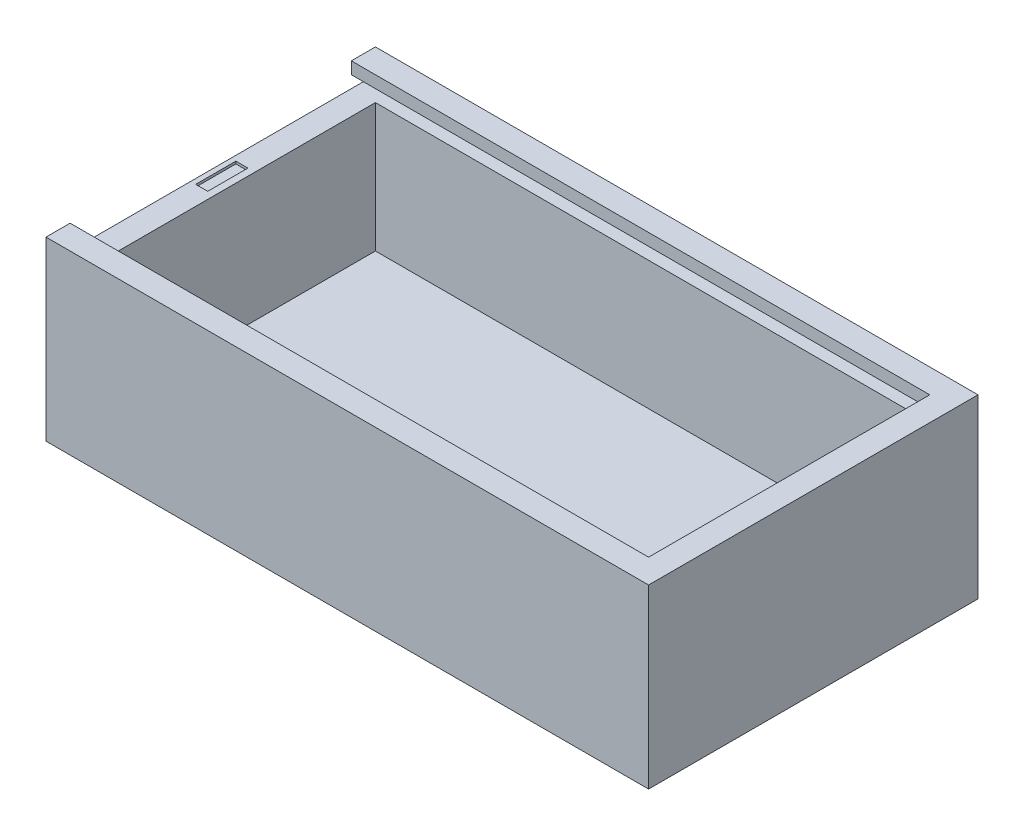
ISO-10303-21;
HEADER;
FILE_DESCRIPTION(('STEP AP214'),'2;1');
FILE_NAME('part.step','',(''),(''),'','','');
FILE_SCHEMA(('AUTOMOTIVE_DESIGN { 1 0 10303 214 1 1 1 1 }'));
ENDSEC;
DATA;
#1=APPLICATION_CONTEXT('core data for automotive mechanical design processes');
#2=APPLICATION_PROTOCOL_DEFINITION('international standard','automotive_design',2000,#1);
#3=PRODUCT_CONTEXT('',#1,'mechanical');
#4=PRODUCT('Part','Part','',(#3));
#5=PRODUCT_RELATED_PRODUCT_CATEGORY('part','',(#4));
#6=PRODUCT_DEFINITION_FORMATION('','',#4);
#7=PRODUCT_DEFINITION_CONTEXT('part definition',#1,'design');
#8=PRODUCT_DEFINITION('design','',#6,#7);
#9=PRODUCT_DEFINITION_SHAPE('','',#8);
#10=(LENGTH_UNIT() NAMED_UNIT(*) SI_UNIT(.MILLI.,.METRE.));
#11=(NAMED_UNIT(*) PLANE_ANGLE_UNIT() SI_UNIT($,.RADIAN.));
#12=(NAMED_UNIT(*) SI_UNIT($,.STERADIAN.) SOLID_ANGLE_UNIT());
#13=UNCERTAINTY_MEASURE_WITH_UNIT(LENGTH_MEASURE(1.E-05),#10,'distance_accuracy_value','');
#14=(GEOMETRIC_REPRESENTATION_CONTEXT(3) GLOBAL_UNCERTAINTY_ASSIGNED_CONTEXT((#13)) GLOBAL_UNIT_ASSIGNED_CONTEXT((#10,
#11,#12)) REPRESENTATION_CONTEXT('',''));
#15=CARTESIAN_POINT('',(0.,0.,0.));
#16=DIRECTION('',(0.,0.,1.));
#17=DIRECTION('',(1.,0.,0.));
#18=AXIS2_PLACEMENT_3D('',#15,#16,#17);
#19=CARTESIAN_POINT('',(34.5,22.,17.5));
#20=DIRECTION('',(-1.,0.,0.));
#21=DIRECTION('',(0.,0.,1.));
#22=AXIS2_PLACEMENT_3D('',#19,#20,#21);
#23=PLANE('',#22);
#24=DIRECTION('',(0.,0.,1.));
#25=VECTOR('',#24,1.);
#26=CARTESIAN_POINT('',(34.5,19.,19.));
#27=LINE('',#26,#25);
#28=CARTESIAN_POINT('',(34.5,19.,-17.5));
#29=VERTEX_POINT('',#28);
#30=CARTESIAN_POINT('',(34.5,19.,17.5));
#31=VERTEX_POINT('',#30);
#32=EDGE_CURVE('E208',#29,#31,#27,.T.);
#33=ORIENTED_EDGE('',*,*,#32,.F.);
#34=DIRECTION('',(0.,-1.,0.));
#35=VECTOR('',#34,1.);
#36=CARTESIAN_POINT('',(34.5,22.,-17.5));
#37=LINE('',#36,#35);
#38=CARTESIAN_POINT('',(34.5,3.,-17.5));
#39=VERTEX_POINT('',#38);
#40=EDGE_CURVE('E286',#29,#39,#37,.T.);
#41=ORIENTED_EDGE('',*,*,#40,.T.);
#42=DIRECTION('',(0.,0.,-1.));
#43=VECTOR('',#42,1.);
#44=CARTESIAN_POINT('',(34.5,3.,0.));
#45=LINE('',#44,#43);
#46=CARTESIAN_POINT('',(34.5,3.,17.5));
#47=VERTEX_POINT('',#46);
#48=EDGE_CURVE('E270',#47,#39,#45,.T.);
#49=ORIENTED_EDGE('',*,*,#48,.F.);
#50=DIRECTION('',(0.,-1.,0.));
#51=VECTOR('',#50,1.);
#52=CARTESIAN_POINT('',(34.5,22.,17.5));
#53=LINE('',#52,#51);
#54=EDGE_CURVE('E58',#31,#47,#53,.T.);
#55=ORIENTED_EDGE('',*,*,#54,.F.);
#56=EDGE_LOOP('',(#33,#41,#49,#55));
#57=FACE_BOUND('',#56,.T.);
#58=ADVANCED_FACE('F35',(#57),#23,.T.);
#59=CARTESIAN_POINT('',(34.5,22.,17.5));
#60=DIRECTION('',(0.,0.,-1.));
#61=DIRECTION('',(-1.,0.,0.));
#62=AXIS2_PLACEMENT_3D('',#59,#60,#61);
#63=PLANE('',#62);
#64=CARTESIAN_POINT('',(34.5,22.,17.5));
#65=VERTEX_POINT('',#64);
#66=CARTESIAN_POINT('',(34.5,20.5,17.5));
#67=VERTEX_POINT('',#66);
#68=EDGE_CURVE('E290',#65,#67,#53,.T.);
#69=ORIENTED_EDGE('',*,*,#68,.T.);
#70=DIRECTION('',(-1.,0.,0.));
#71=VECTOR('',#70,1.);
#72=CARTESIAN_POINT('',(34.5,20.5,17.5));
#73=LINE('',#72,#71);
#74=CARTESIAN_POINT('',(-37.5,20.5,17.5));
#75=VERTEX_POINT('',#74);
#76=EDGE_CURVE('E256',#67,#75,#73,.T.);
#77=ORIENTED_EDGE('',*,*,#76,.T.);
#78=DIRECTION('',(0.,1.,0.));
#79=VECTOR('',#78,1.);
#80=CARTESIAN_POINT('',(-37.5,0.,17.5));
#81=LINE('',#80,#79);
#82=CARTESIAN_POINT('',(-37.5,22.,17.5));
#83=VERTEX_POINT('',#82);
#84=EDGE_CURVE('E236',#75,#83,#81,.T.);
#85=ORIENTED_EDGE('',*,*,#84,.T.);
#86=DIRECTION('',(1.,0.,0.));
#87=VECTOR('',#86,1.);
#88=CARTESIAN_POINT('',(34.5,22.,17.5));
#89=LINE('',#88,#87);
#90=EDGE_CURVE('E276',#83,#65,#89,.T.);
#91=ORIENTED_EDGE('',*,*,#90,.T.);
#92=EDGE_LOOP('',(#69,#77,#85,#91));
#93=FACE_BOUND('',#92,.T.);
#94=ADVANCED_FACE('F350',(#93),#63,.T.);
#95=CARTESIAN_POINT('',(34.5,22.,-17.5));
#96=DIRECTION('',(0.,0.,1.));
#97=DIRECTION('',(1.,0.,0.));
#98=AXIS2_PLACEMENT_3D('',#95,#96,#97);
#99=PLANE('',#98);
#100=DIRECTION('',(1.,0.,0.));
#101=VECTOR('',#100,1.);
#102=CARTESIAN_POINT('',(34.5,19.,-17.5));
#103=LINE('',#102,#101);
#104=CARTESIAN_POINT('',(-34.5,19.,-17.5));
#105=VERTEX_POINT('',#104);
#106=EDGE_CURVE('E251',#105,#29,#103,.T.);
#107=ORIENTED_EDGE('',*,*,#106,.F.);
#108=DIRECTION('',(0.,-1.,0.));
#109=VECTOR('',#108,1.);
#110=CARTESIAN_POINT('',(-34.5,22.,-17.5));
#111=LINE('',#110,#109);
#112=CARTESIAN_POINT('',(-34.5,3.,-17.5));
#113=VERTEX_POINT('',#112);
#114=EDGE_CURVE('E284',#105,#113,#111,.T.);
#115=ORIENTED_EDGE('',*,*,#114,.T.);
#116=DIRECTION('',(-1.,0.,0.));
#117=VECTOR('',#116,1.);
#118=CARTESIAN_POINT('',(0.,3.,-17.5));
#119=LINE('',#118,#117);
#120=EDGE_CURVE('E273',#39,#113,#119,.T.);
#121=ORIENTED_EDGE('',*,*,#120,.F.);
#122=ORIENTED_EDGE('',*,*,#40,.F.);
#123=EDGE_LOOP('',(#107,#115,#121,#122));
#124=FACE_BOUND('',#123,.T.);
#125=ADVANCED_FACE('F384',(#124),#99,.T.);
#126=CARTESIAN_POINT('',(0.,22.,0.));
#127=DIRECTION('',(0.,1.,0.));
#128=DIRECTION('',(0.,0.,1.));
#129=AXIS2_PLACEMENT_3D('',#126,#127,#128);
#130=PLANE('',#129);
#131=DIRECTION('',(0.,0.,1.));
#132=VECTOR('',#131,1.);
#133=CARTESIAN_POINT('',(-37.5,22.,-20.5));
#134=LINE('',#133,#132);
#135=CARTESIAN_POINT('',(-37.5,22.,-20.5));
#136=VERTEX_POINT('',#135);
#137=CARTESIAN_POINT('',(-37.5,22.,-17.5));
#138=VERTEX_POINT('',#137);
#139=EDGE_CURVE('E294',#136,#138,#134,.T.);
#140=ORIENTED_EDGE('',*,*,#139,.T.);
#141=DIRECTION('',(-1.,0.,0.));
#142=VECTOR('',#141,1.);
#143=CARTESIAN_POINT('',(34.5,22.,-17.5));
#144=LINE('',#143,#142);
#145=CARTESIAN_POINT('',(34.5,22.,-17.5));
#146=VERTEX_POINT('',#145);
#147=EDGE_CURVE('E280',#146,#138,#144,.T.);
#148=ORIENTED_EDGE('',*,*,#147,.F.);
#149=DIRECTION('',(0.,0.,-1.));
#150=VECTOR('',#149,1.);
#151=CARTESIAN_POINT('',(34.5,22.,17.5));
#152=LINE('',#151,#150);
#153=EDGE_CURVE('E278',#65,#146,#152,.T.);
#154=ORIENTED_EDGE('',*,*,#153,.F.);
#155=ORIENTED_EDGE('',*,*,#90,.F.);
#156=CARTESIAN_POINT('',(-37.5,22.,20.5));
#157=VERTEX_POINT('',#156);
#158=EDGE_CURVE('E298',#83,#157,#134,.T.);
#159=ORIENTED_EDGE('',*,*,#158,.T.);
#160=DIRECTION('',(1.,0.,0.));
#161=VECTOR('',#160,1.);
#162=CARTESIAN_POINT('',(-37.5,22.,20.5));
#163=LINE('',#162,#161);
#164=CARTESIAN_POINT('',(37.5,22.,20.5));
#165=VERTEX_POINT('',#164);
#166=EDGE_CURVE('E297',#157,#165,#163,.T.);
#167=ORIENTED_EDGE('',*,*,#166,.T.);
#168=DIRECTION('',(0.,0.,-1.));
#169=VECTOR('',#168,1.);
#170=CARTESIAN_POINT('',(37.5,22.,-20.5));
#171=LINE('',#170,#169);
#172=CARTESIAN_POINT('',(37.5,22.,-20.5));
#173=VERTEX_POINT('',#172);
#174=EDGE_CURVE('E300',#165,#173,#171,.T.);
#175=ORIENTED_EDGE('',*,*,#174,.T.);
#176=DIRECTION('',(-1.,0.,0.));
#177=VECTOR('',#176,1.);
#178=CARTESIAN_POINT('',(-37.5,22.,-20.5));
#179=LINE('',#178,#177);
#180=EDGE_CURVE('E302',#173,#136,#179,.T.);
#181=ORIENTED_EDGE('',*,*,#180,.T.);
#182=EDGE_LOOP('',(#140,#148,#154,#155,#159,#167,#175,#181));
#183=FACE_BOUND('',#182,.T.);
#184=ADVANCED_FACE('F344',(#183),#130,.T.);
#185=CARTESIAN_POINT('',(0.,0.,0.));
#186=DIRECTION('',(0.,1.,0.));
#187=DIRECTION('',(0.,0.,1.));
#188=AXIS2_PLACEMENT_3D('',#185,#186,#187);
#189=PLANE('',#188);
#190=DIRECTION('',(0.,0.,1.));
#191=VECTOR('',#190,1.);
#192=CARTESIAN_POINT('',(-37.5,0.,-20.5));
#193=LINE('',#192,#191);
#194=CARTESIAN_POINT('',(-37.5,0.,-20.5));
#195=VERTEX_POINT('',#194);
#196=CARTESIAN_POINT('',(-37.5,0.,20.5));
#197=VERTEX_POINT('',#196);
#198=EDGE_CURVE('E293',#195,#197,#193,.T.);
#199=ORIENTED_EDGE('',*,*,#198,.F.);
#200=DIRECTION('',(-1.,0.,0.));
#201=VECTOR('',#200,1.);
#202=CARTESIAN_POINT('',(-37.5,0.,-20.5));
#203=LINE('',#202,#201);
#204=CARTESIAN_POINT('',(37.5,0.,-20.5));
#205=VERTEX_POINT('',#204);
#206=EDGE_CURVE('E311',#205,#195,#203,.T.);
#207=ORIENTED_EDGE('',*,*,#206,.F.);
#208=DIRECTION('',(0.,0.,-1.));
#209=VECTOR('',#208,1.);
#210=CARTESIAN_POINT('',(37.5,0.,-20.5));
#211=LINE('',#210,#209);
#212=CARTESIAN_POINT('',(37.5,0.,20.5));
#213=VERTEX_POINT('',#212);
#214=EDGE_CURVE('E309',#213,#205,#211,.T.);
#215=ORIENTED_EDGE('',*,*,#214,.F.);
#216=DIRECTION('',(1.,0.,0.));
#217=VECTOR('',#216,1.);
#218=CARTESIAN_POINT('',(-37.5,0.,20.5));
#219=LINE('',#218,#217);
#220=EDGE_CURVE('E307',#197,#213,#219,.T.);
#221=ORIENTED_EDGE('',*,*,#220,.F.);
#222=EDGE_LOOP('',(#199,#207,#215,#221));
#223=FACE_BOUND('',#222,.T.);
#224=ADVANCED_FACE('F334',(#223),#189,.F.);
#225=CARTESIAN_POINT('',(-37.5,22.,-20.5));
#226=DIRECTION('',(1.,0.,0.));
#227=DIRECTION('',(0.,0.,-1.));
#228=AXIS2_PLACEMENT_3D('',#225,#226,#227);
#229=PLANE('',#228);
#230=DIRECTION('',(0.,0.,-1.));
#231=VECTOR('',#230,1.);
#232=CARTESIAN_POINT('',(-37.5,20.5,0.));
#233=LINE('',#232,#231);
#234=CARTESIAN_POINT('',(-37.5,20.5,-17.5));
#235=VERTEX_POINT('',#234);
#236=CARTESIAN_POINT('',(-37.5,20.5,-19.));
#237=VERTEX_POINT('',#236);
#238=EDGE_CURVE('E242',#235,#237,#233,.T.);
#239=ORIENTED_EDGE('',*,*,#238,.F.);
#240=DIRECTION('',(0.,-1.,0.));
#241=VECTOR('',#240,1.);
#242=CARTESIAN_POINT('',(-37.5,0.,-17.5));
#243=LINE('',#242,#241);
#244=EDGE_CURVE('E239',#138,#235,#243,.T.);
#245=ORIENTED_EDGE('',*,*,#244,.F.);
#246=ORIENTED_EDGE('',*,*,#139,.F.);
#247=DIRECTION('',(0.,-1.,0.));
#248=VECTOR('',#247,1.);
#249=CARTESIAN_POINT('',(-37.5,22.,-20.5));
#250=LINE('',#249,#248);
#251=EDGE_CURVE('E304',#136,#195,#250,.T.);
#252=ORIENTED_EDGE('',*,*,#251,.T.);
#253=ORIENTED_EDGE('',*,*,#198,.T.);
#254=DIRECTION('',(0.,-1.,0.));
#255=VECTOR('',#254,1.);
#256=CARTESIAN_POINT('',(-37.5,22.,20.5));
#257=LINE('',#256,#255);
#258=EDGE_CURVE('E43',#157,#197,#257,.T.);
#259=ORIENTED_EDGE('',*,*,#258,.F.);
#260=ORIENTED_EDGE('',*,*,#158,.F.);
#261=ORIENTED_EDGE('',*,*,#84,.F.);
#262=DIRECTION('',(0.,0.,1.));
#263=VECTOR('',#262,1.);
#264=CARTESIAN_POINT('',(-37.5,20.5,0.));
#265=LINE('',#264,#263);
#266=CARTESIAN_POINT('',(-37.5,20.5,19.));
#267=VERTEX_POINT('',#266);
#268=EDGE_CURVE('E233',#75,#267,#265,.T.);
#269=ORIENTED_EDGE('',*,*,#268,.T.);
#270=DIRECTION('',(0.,-1.,0.));
#271=VECTOR('',#270,1.);
#272=CARTESIAN_POINT('',(-37.5,0.,19.));
#273=LINE('',#272,#271);
#274=CARTESIAN_POINT('',(-37.5,19.,19.));
#275=VERTEX_POINT('',#274);
#276=EDGE_CURVE('E230',#267,#275,#273,.T.);
#277=ORIENTED_EDGE('',*,*,#276,.T.);
#278=DIRECTION('',(0.,0.,1.));
#279=VECTOR('',#278,1.);
#280=CARTESIAN_POINT('',(-37.5,19.,0.));
#281=LINE('',#280,#279);
#282=CARTESIAN_POINT('',(-37.5,19.,-19.));
#283=VERTEX_POINT('',#282);
#284=EDGE_CURVE('E225',#283,#275,#281,.T.);
#285=ORIENTED_EDGE('',*,*,#284,.F.);
#286=DIRECTION('',(0.,-1.,0.));
#287=VECTOR('',#286,1.);
#288=CARTESIAN_POINT('',(-37.5,0.,-19.));
#289=LINE('',#288,#287);
#290=EDGE_CURVE('E245',#237,#283,#289,.T.);
#291=ORIENTED_EDGE('',*,*,#290,.F.);
#292=EDGE_LOOP('',(#239,#245,#246,#252,#253,#259,#260,#261,#269,#277,#285,#291));
#293=FACE_BOUND('',#292,.T.);
#294=ADVANCED_FACE('F37',(#293),#229,.F.);
#295=CARTESIAN_POINT('',(-37.5,22.,20.5));
#296=DIRECTION('',(0.,0.,-1.));
#297=DIRECTION('',(-1.,0.,0.));
#298=AXIS2_PLACEMENT_3D('',#295,#296,#297);
#299=PLANE('',#298);
#300=ORIENTED_EDGE('',*,*,#220,.T.);
#301=DIRECTION('',(0.,-1.,0.));
#302=VECTOR('',#301,1.);
#303=CARTESIAN_POINT('',(37.5,22.,20.5));
#304=LINE('',#303,#302);
#305=EDGE_CURVE('E318',#165,#213,#304,.T.);
#306=ORIENTED_EDGE('',*,*,#305,.F.);
#307=ORIENTED_EDGE('',*,*,#166,.F.);
#308=ORIENTED_EDGE('',*,*,#258,.T.);
#309=EDGE_LOOP('',(#300,#306,#307,#308));
#310=FACE_BOUND('',#309,.T.);
#311=ADVANCED_FACE('F324',(#310),#299,.F.);
#312=CARTESIAN_POINT('',(37.5,22.,-20.5));
#313=DIRECTION('',(-1.,0.,0.));
#314=DIRECTION('',(0.,0.,1.));
#315=AXIS2_PLACEMENT_3D('',#312,#313,#314);
#316=PLANE('',#315);
#317=ORIENTED_EDGE('',*,*,#214,.T.);
#318=DIRECTION('',(0.,-1.,0.));
#319=VECTOR('',#318,1.);
#320=CARTESIAN_POINT('',(37.5,22.,-20.5));
#321=LINE('',#320,#319);
#322=EDGE_CURVE('E315',#173,#205,#321,.T.);
#323=ORIENTED_EDGE('',*,*,#322,.F.);
#324=ORIENTED_EDGE('',*,*,#174,.F.);
#325=ORIENTED_EDGE('',*,*,#305,.T.);
#326=EDGE_LOOP('',(#317,#323,#324,#325));
#327=FACE_BOUND('',#326,.T.);
#328=ADVANCED_FACE('F338',(#327),#316,.F.);
#329=CARTESIAN_POINT('',(-37.5,22.,-20.5));
#330=DIRECTION('',(0.,0.,1.));
#331=DIRECTION('',(1.,0.,0.));
#332=AXIS2_PLACEMENT_3D('',#329,#330,#331);
#333=PLANE('',#332);
#334=ORIENTED_EDGE('',*,*,#206,.T.);
#335=ORIENTED_EDGE('',*,*,#251,.F.);
#336=ORIENTED_EDGE('',*,*,#180,.F.);
#337=ORIENTED_EDGE('',*,*,#322,.T.);
#338=EDGE_LOOP('',(#334,#335,#336,#337));
#339=FACE_BOUND('',#338,.T.);
#340=ADVANCED_FACE('F342',(#339),#333,.F.);
#341=DIRECTION('',(-1.,0.,0.));
#342=VECTOR('',#341,1.);
#343=CARTESIAN_POINT('',(34.5,19.,17.5));
#344=LINE('',#343,#342);
#345=CARTESIAN_POINT('',(-34.5,19.,17.5));
#346=VERTEX_POINT('',#345);
#347=EDGE_CURVE('E263',#31,#346,#344,.T.);
#348=ORIENTED_EDGE('',*,*,#347,.F.);
#349=ORIENTED_EDGE('',*,*,#54,.T.);
#350=DIRECTION('',(-1.,0.,0.));
#351=VECTOR('',#350,1.);
#352=CARTESIAN_POINT('',(0.,3.,17.5));
#353=LINE('',#352,#351);
#354=CARTESIAN_POINT('',(-34.5,3.,17.5));
#355=VERTEX_POINT('',#354);
#356=EDGE_CURVE('E268',#47,#355,#353,.T.);
#357=ORIENTED_EDGE('',*,*,#356,.T.);
#358=DIRECTION('',(0.,-1.,0.));
#359=VECTOR('',#358,1.);
#360=CARTESIAN_POINT('',(-34.5,22.,17.5));
#361=LINE('',#360,#359);
#362=EDGE_CURVE('E282',#346,#355,#361,.T.);
#363=ORIENTED_EDGE('',*,*,#362,.F.);
#364=EDGE_LOOP('',(#348,#349,#357,#363));
#365=FACE_BOUND('',#364,.T.);
#366=ADVANCED_FACE('F376',(#365),#63,.T.);
#367=DIRECTION('',(0.,0.,-1.));
#368=VECTOR('',#367,1.);
#369=CARTESIAN_POINT('',(34.5,20.5,-19.));
#370=LINE('',#369,#368);
#371=CARTESIAN_POINT('',(34.5,20.5,-17.5));
#372=VERTEX_POINT('',#371);
#373=EDGE_CURVE('E216',#67,#372,#370,.T.);
#374=ORIENTED_EDGE('',*,*,#373,.F.);
#375=ORIENTED_EDGE('',*,*,#68,.F.);
#376=ORIENTED_EDGE('',*,*,#153,.T.);
#377=EDGE_CURVE('E287',#146,#372,#37,.T.);
#378=ORIENTED_EDGE('',*,*,#377,.T.);
#379=EDGE_LOOP('',(#374,#375,#376,#378));
#380=FACE_BOUND('',#379,.T.);
#381=ADVANCED_FACE('F374',(#380),#23,.T.);
#382=DIRECTION('',(-1.,0.,0.));
#383=VECTOR('',#382,1.);
#384=CARTESIAN_POINT('',(34.5,20.5,-17.5));
#385=LINE('',#384,#383);
#386=EDGE_CURVE('E254',#372,#235,#385,.T.);
#387=ORIENTED_EDGE('',*,*,#386,.F.);
#388=ORIENTED_EDGE('',*,*,#377,.F.);
#389=ORIENTED_EDGE('',*,*,#147,.T.);
#390=ORIENTED_EDGE('',*,*,#244,.T.);
#391=EDGE_LOOP('',(#387,#388,#389,#390));
#392=FACE_BOUND('',#391,.T.);
#393=ADVANCED_FACE('F371',(#392),#99,.T.);
#394=CARTESIAN_POINT('',(-34.5,22.,17.5));
#395=DIRECTION('',(1.,0.,0.));
#396=DIRECTION('',(0.,0.,-1.));
#397=AXIS2_PLACEMENT_3D('',#394,#395,#396);
#398=PLANE('',#397);
#399=DIRECTION('',(0.,0.,-1.));
#400=VECTOR('',#399,1.);
#401=CARTESIAN_POINT('',(-34.5,19.,17.5));
#402=LINE('',#401,#400);
#403=EDGE_CURVE('E11',#346,#105,#402,.T.);
#404=ORIENTED_EDGE('',*,*,#403,.F.);
#405=ORIENTED_EDGE('',*,*,#362,.T.);
#406=DIRECTION('',(0.,0.,-1.));
#407=VECTOR('',#406,1.);
#408=CARTESIAN_POINT('',(-34.5,3.,0.));
#409=LINE('',#408,#407);
#410=EDGE_CURVE('E265',#355,#113,#409,.T.);
#411=ORIENTED_EDGE('',*,*,#410,.T.);
#412=ORIENTED_EDGE('',*,*,#114,.F.);
#413=EDGE_LOOP('',(#404,#405,#411,#412));
#414=FACE_BOUND('',#413,.T.);
#415=ADVANCED_FACE('F382',(#414),#398,.T.);
#416=CARTESIAN_POINT('',(0.,3.,0.));
#417=DIRECTION('',(0.,1.,0.));
#418=DIRECTION('',(0.,0.,1.));
#419=AXIS2_PLACEMENT_3D('',#416,#417,#418);
#420=PLANE('',#419);
#421=ORIENTED_EDGE('',*,*,#410,.F.);
#422=ORIENTED_EDGE('',*,*,#356,.F.);
#423=ORIENTED_EDGE('',*,*,#48,.T.);
#424=ORIENTED_EDGE('',*,*,#120,.T.);
#425=EDGE_LOOP('',(#421,#422,#423,#424));
#426=FACE_BOUND('',#425,.T.);
#427=ADVANCED_FACE('F401',(#426),#420,.T.);
#428=CARTESIAN_POINT('',(34.5,19.,0.));
#429=DIRECTION('',(0.,-1.,0.));
#430=DIRECTION('',(0.,0.,-1.));
#431=AXIS2_PLACEMENT_3D('',#428,#429,#430);
#432=PLANE('',#431);
#433=DIRECTION('',(1.,0.,0.));
#434=VECTOR('',#433,1.);
#435=CARTESIAN_POINT('',(-36.871212609298,19.,2.5));
#436=LINE('',#435,#434);
#437=CARTESIAN_POINT('',(-36.871212609298,19.,2.5));
#438=VERTEX_POINT('',#437);
#439=CARTESIAN_POINT('',(-35.371212609298,19.,2.5));
#440=VERTEX_POINT('',#439);
#441=EDGE_CURVE('E202',#438,#440,#436,.T.);
#442=ORIENTED_EDGE('',*,*,#441,.F.);
#443=DIRECTION('',(0.,0.,1.));
#444=VECTOR('',#443,1.);
#445=CARTESIAN_POINT('',(-36.871212609298,19.,2.5));
#446=LINE('',#445,#444);
#447=CARTESIAN_POINT('',(-36.871212609298,19.,-2.5));
#448=VERTEX_POINT('',#447);
#449=EDGE_CURVE('E50',#448,#438,#446,.T.);
#450=ORIENTED_EDGE('',*,*,#449,.F.);
#451=DIRECTION('',(-1.,0.,0.));
#452=VECTOR('',#451,1.);
#453=CARTESIAN_POINT('',(-36.871212609298,19.,-2.5));
#454=LINE('',#453,#452);
#455=CARTESIAN_POINT('',(-35.371212609298,19.,-2.5));
#456=VERTEX_POINT('',#455);
#457=EDGE_CURVE('E193',#456,#448,#454,.T.);
#458=ORIENTED_EDGE('',*,*,#457,.F.);
#459=DIRECTION('',(0.,0.,-1.));
#460=VECTOR('',#459,1.);
#461=CARTESIAN_POINT('',(-35.371212609298,19.,2.5));
#462=LINE('',#461,#460);
#463=EDGE_CURVE('E196',#440,#456,#462,.T.);
#464=ORIENTED_EDGE('',*,*,#463,.F.);
#465=EDGE_LOOP('',(#442,#450,#458,#464));
#466=FACE_BOUND('',#465,.T.);
#467=ORIENTED_EDGE('',*,*,#106,.T.);
#468=ORIENTED_EDGE('',*,*,#32,.T.);
#469=ORIENTED_EDGE('',*,*,#347,.T.);
#470=ORIENTED_EDGE('',*,*,#403,.T.);
#471=EDGE_LOOP('',(#467,#468,#469,#470));
#472=FACE_BOUND('',#471,.T.);
#473=DIRECTION('',(0.,0.,1.));
#474=VECTOR('',#473,1.);
#475=CARTESIAN_POINT('',(36.,19.,19.));
#476=LINE('',#475,#474);
#477=CARTESIAN_POINT('',(36.,19.,-19.));
#478=VERTEX_POINT('',#477);
#479=CARTESIAN_POINT('',(36.,19.,19.));
#480=VERTEX_POINT('',#479);
#481=EDGE_CURVE('E212',#478,#480,#476,.T.);
#482=ORIENTED_EDGE('',*,*,#481,.F.);
#483=DIRECTION('',(-1.,0.,0.));
#484=VECTOR('',#483,1.);
#485=CARTESIAN_POINT('',(34.5,19.,-19.));
#486=LINE('',#485,#484);
#487=EDGE_CURVE('E249',#478,#283,#486,.T.);
#488=ORIENTED_EDGE('',*,*,#487,.T.);
#489=ORIENTED_EDGE('',*,*,#284,.T.);
#490=DIRECTION('',(-1.,0.,0.));
#491=VECTOR('',#490,1.);
#492=CARTESIAN_POINT('',(34.5,19.,19.));
#493=LINE('',#492,#491);
#494=EDGE_CURVE('E248',#480,#275,#493,.T.);
#495=ORIENTED_EDGE('',*,*,#494,.F.);
#496=EDGE_LOOP('',(#482,#488,#489,#495));
#497=FACE_BOUND('',#496,.T.);
#498=ADVANCED_FACE('F364',(#466,#472,#497),#432,.F.);
#499=CARTESIAN_POINT('',(34.5,0.,-19.));
#500=DIRECTION('',(0.,0.,-1.));
#501=DIRECTION('',(-1.,0.,0.));
#502=AXIS2_PLACEMENT_3D('',#499,#500,#501);
#503=PLANE('',#502);
#504=ORIENTED_EDGE('',*,*,#290,.T.);
#505=ORIENTED_EDGE('',*,*,#487,.F.);
#506=DIRECTION('',(0.,-1.,0.));
#507=VECTOR('',#506,1.);
#508=CARTESIAN_POINT('',(36.,19.,-19.));
#509=LINE('',#508,#507);
#510=CARTESIAN_POINT('',(36.,20.5,-19.));
#511=VERTEX_POINT('',#510);
#512=EDGE_CURVE('E222',#511,#478,#509,.T.);
#513=ORIENTED_EDGE('',*,*,#512,.F.);
#514=DIRECTION('',(-1.,0.,0.));
#515=VECTOR('',#514,1.);
#516=CARTESIAN_POINT('',(34.5,20.5,-19.));
#517=LINE('',#516,#515);
#518=EDGE_CURVE('E252',#511,#237,#517,.T.);
#519=ORIENTED_EDGE('',*,*,#518,.T.);
#520=EDGE_LOOP('',(#504,#505,#513,#519));
#521=FACE_BOUND('',#520,.T.);
#522=ADVANCED_FACE('F367',(#521),#503,.F.);
#523=CARTESIAN_POINT('',(34.5,20.5,0.));
#524=DIRECTION('',(0.,1.,0.));
#525=DIRECTION('',(0.,0.,1.));
#526=AXIS2_PLACEMENT_3D('',#523,#524,#525);
#527=PLANE('',#526);
#528=ORIENTED_EDGE('',*,*,#238,.T.);
#529=ORIENTED_EDGE('',*,*,#518,.F.);
#530=DIRECTION('',(0.,0.,-1.));
#531=VECTOR('',#530,1.);
#532=CARTESIAN_POINT('',(36.,20.5,-19.));
#533=LINE('',#532,#531);
#534=CARTESIAN_POINT('',(36.,20.5,19.));
#535=VERTEX_POINT('',#534);
#536=EDGE_CURVE('E219',#535,#511,#533,.T.);
#537=ORIENTED_EDGE('',*,*,#536,.F.);
#538=DIRECTION('',(-1.,0.,0.));
#539=VECTOR('',#538,1.);
#540=CARTESIAN_POINT('',(34.5,20.5,19.));
#541=LINE('',#540,#539);
#542=EDGE_CURVE('E258',#535,#267,#541,.T.);
#543=ORIENTED_EDGE('',*,*,#542,.T.);
#544=ORIENTED_EDGE('',*,*,#268,.F.);
#545=ORIENTED_EDGE('',*,*,#76,.F.);
#546=ORIENTED_EDGE('',*,*,#373,.T.);
#547=ORIENTED_EDGE('',*,*,#386,.T.);
#548=EDGE_LOOP('',(#528,#529,#537,#543,#544,#545,#546,#547));
#549=FACE_BOUND('',#548,.T.);
#550=ADVANCED_FACE('F354',(#549),#527,.F.);
#551=CARTESIAN_POINT('',(34.5,0.,19.));
#552=DIRECTION('',(0.,0.,-1.));
#553=DIRECTION('',(-1.,0.,0.));
#554=AXIS2_PLACEMENT_3D('',#551,#552,#553);
#555=PLANE('',#554);
#556=ORIENTED_EDGE('',*,*,#276,.F.);
#557=ORIENTED_EDGE('',*,*,#542,.F.);
#558=DIRECTION('',(0.,1.,0.));
#559=VECTOR('',#558,1.);
#560=CARTESIAN_POINT('',(36.,20.5,19.));
#561=LINE('',#560,#559);
#562=EDGE_CURVE('E215',#480,#535,#561,.T.);
#563=ORIENTED_EDGE('',*,*,#562,.F.);
#564=ORIENTED_EDGE('',*,*,#494,.T.);
#565=EDGE_LOOP('',(#556,#557,#563,#564));
#566=FACE_BOUND('',#565,.T.);
#567=ADVANCED_FACE('F359',(#566),#555,.T.);
#568=CARTESIAN_POINT('',(36.,0.,0.));
#569=DIRECTION('',(1.,0.,0.));
#570=DIRECTION('',(0.,0.,-1.));
#571=AXIS2_PLACEMENT_3D('',#568,#569,#570);
#572=PLANE('',#571);
#573=ORIENTED_EDGE('',*,*,#481,.T.);
#574=ORIENTED_EDGE('',*,*,#562,.T.);
#575=ORIENTED_EDGE('',*,*,#536,.T.);
#576=ORIENTED_EDGE('',*,*,#512,.T.);
#577=EDGE_LOOP('',(#573,#574,#575,#576));
#578=FACE_BOUND('',#577,.T.);
#579=ADVANCED_FACE('F416',(#578),#572,.F.);
#580=CARTESIAN_POINT('',(-36.871212609298,18.7,2.5));
#581=DIRECTION('',(-1.,0.,0.));
#582=DIRECTION('',(0.,0.,1.));
#583=AXIS2_PLACEMENT_3D('',#580,#581,#582);
#584=PLANE('',#583);
#585=ORIENTED_EDGE('',*,*,#449,.T.);
#586=DIRECTION('',(0.,1.,0.));
#587=VECTOR('',#586,1.);
#588=CARTESIAN_POINT('',(-36.871212609298,18.7,2.5));
#589=LINE('',#588,#587);
#590=CARTESIAN_POINT('',(-36.871212609298,18.7,2.5));
#591=VERTEX_POINT('',#590);
#592=EDGE_CURVE('E171',#591,#438,#589,.T.);
#593=ORIENTED_EDGE('',*,*,#592,.F.);
#594=DIRECTION('',(0.,0.,1.));
#595=VECTOR('',#594,1.);
#596=CARTESIAN_POINT('',(-36.871212609298,18.7,2.5));
#597=LINE('',#596,#595);
#598=CARTESIAN_POINT('',(-36.871212609298,18.7,-2.5));
#599=VERTEX_POINT('',#598);
#600=EDGE_CURVE('E175',#599,#591,#597,.T.);
#601=ORIENTED_EDGE('',*,*,#600,.F.);
#602=DIRECTION('',(0.,1.,0.));
#603=VECTOR('',#602,1.);
#604=CARTESIAN_POINT('',(-36.871212609298,18.7,-2.5));
#605=LINE('',#604,#603);
#606=EDGE_CURVE('E206',#599,#448,#605,.T.);
#607=ORIENTED_EDGE('',*,*,#606,.T.);
#608=EDGE_LOOP('',(#585,#593,#601,#607));
#609=FACE_BOUND('',#608,.T.);
#610=ADVANCED_FACE('F173',(#609),#584,.F.);
#611=CARTESIAN_POINT('',(-36.871212609298,18.7,-2.5));
#612=DIRECTION('',(0.,0.,-1.));
#613=DIRECTION('',(-1.,0.,0.));
#614=AXIS2_PLACEMENT_3D('',#611,#612,#613);
#615=PLANE('',#614);
#616=ORIENTED_EDGE('',*,*,#457,.T.);
#617=ORIENTED_EDGE('',*,*,#606,.F.);
#618=DIRECTION('',(-1.,0.,0.));
#619=VECTOR('',#618,1.);
#620=CARTESIAN_POINT('',(-36.871212609298,18.7,-2.5));
#621=LINE('',#620,#619);
#622=CARTESIAN_POINT('',(-35.371212609298,18.7,-2.5));
#623=VERTEX_POINT('',#622);
#624=EDGE_CURVE('E181',#623,#599,#621,.T.);
#625=ORIENTED_EDGE('',*,*,#624,.F.);
#626=DIRECTION('',(0.,1.,0.));
#627=VECTOR('',#626,1.);
#628=CARTESIAN_POINT('',(-35.371212609298,18.7,-2.5));
#629=LINE('',#628,#627);
#630=EDGE_CURVE('E209',#623,#456,#629,.T.);
#631=ORIENTED_EDGE('',*,*,#630,.T.);
#632=EDGE_LOOP('',(#616,#617,#625,#631));
#633=FACE_BOUND('',#632,.T.);
#634=ADVANCED_FACE('F426',(#633),#615,.F.);
#635=CARTESIAN_POINT('',(-35.371212609298,18.7,2.5));
#636=DIRECTION('',(1.,0.,0.));
#637=DIRECTION('',(0.,0.,-1.));
#638=AXIS2_PLACEMENT_3D('',#635,#636,#637);
#639=PLANE('',#638);
#640=ORIENTED_EDGE('',*,*,#463,.T.);
#641=ORIENTED_EDGE('',*,*,#630,.F.);
#642=DIRECTION('',(0.,0.,-1.));
#643=VECTOR('',#642,1.);
#644=CARTESIAN_POINT('',(-35.371212609298,18.7,2.5));
#645=LINE('',#644,#643);
#646=CARTESIAN_POINT('',(-35.371212609298,18.7,2.5));
#647=VERTEX_POINT('',#646);
#648=EDGE_CURVE('E189',#647,#623,#645,.T.);
#649=ORIENTED_EDGE('',*,*,#648,.F.);
#650=DIRECTION('',(0.,1.,0.));
#651=VECTOR('',#650,1.);
#652=CARTESIAN_POINT('',(-35.371212609298,18.7,2.5));
#653=LINE('',#652,#651);
#654=EDGE_CURVE('E180',#647,#440,#653,.T.);
#655=ORIENTED_EDGE('',*,*,#654,.T.);
#656=EDGE_LOOP('',(#640,#641,#649,#655));
#657=FACE_BOUND('',#656,.T.);
#658=ADVANCED_FACE('F429',(#657),#639,.F.);
#659=CARTESIAN_POINT('',(-36.871212609298,18.7,2.5));
#660=DIRECTION('',(0.,0.,1.));
#661=DIRECTION('',(1.,0.,0.));
#662=AXIS2_PLACEMENT_3D('',#659,#660,#661);
#663=PLANE('',#662);
#664=ORIENTED_EDGE('',*,*,#441,.T.);
#665=ORIENTED_EDGE('',*,*,#654,.F.);
#666=DIRECTION('',(1.,0.,0.));
#667=VECTOR('',#666,1.);
#668=CARTESIAN_POINT('',(-36.871212609298,18.7,2.5));
#669=LINE('',#668,#667);
#670=EDGE_CURVE('E184',#591,#647,#669,.T.);
#671=ORIENTED_EDGE('',*,*,#670,.F.);
#672=ORIENTED_EDGE('',*,*,#592,.T.);
#673=EDGE_LOOP('',(#664,#665,#671,#672));
#674=FACE_BOUND('',#673,.T.);
#675=ADVANCED_FACE('F185',(#674),#663,.F.);
#676=CARTESIAN_POINT('',(0.,18.7,0.));
#677=DIRECTION('',(0.,-1.,0.));
#678=DIRECTION('',(0.,0.,-1.));
#679=AXIS2_PLACEMENT_3D('',#676,#677,#678);
#680=PLANE('',#679);
#681=ORIENTED_EDGE('',*,*,#600,.T.);
#682=ORIENTED_EDGE('',*,*,#670,.T.);
#683=ORIENTED_EDGE('',*,*,#648,.T.);
#684=ORIENTED_EDGE('',*,*,#624,.T.);
#685=EDGE_LOOP('',(#681,#682,#683,#684));
#686=FACE_BOUND('',#685,.T.);
#687=ADVANCED_FACE('F191',(#686),#680,.F.);
#688=CLOSED_SHELL('',(#58,#94,#125,#184,#224,#294,#311,#328,#340,#366,#381,#393,#415,#427,#498,
#522,#550,#567,#579,#610,#634,#658,#675,#687));
#689=MANIFOLD_SOLID_BREP('B2',#688);
#690=ADVANCED_BREP_SHAPE_REPRESENTATION('',(#18,#689),#14);
#691=SHAPE_DEFINITION_REPRESENTATION(#9,#690);
ENDSEC;
END-ISO-10303-21;
